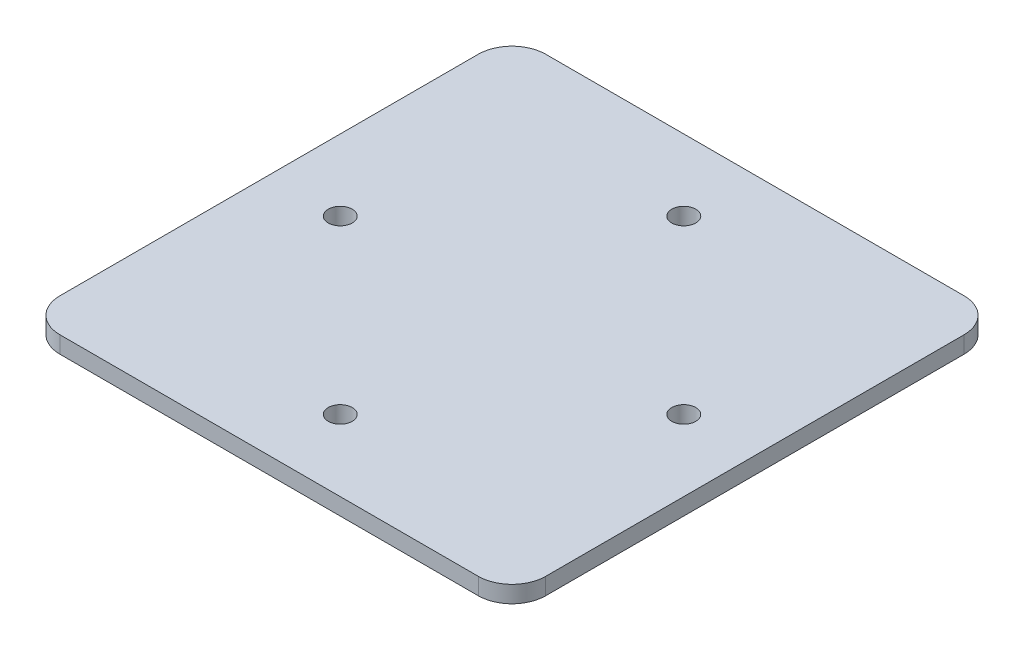
ISO-10303-21;
HEADER;
FILE_DESCRIPTION(('STEP AP214'),'2;1');
FILE_NAME('part.step','',(''),(''),'','','');
FILE_SCHEMA(('AUTOMOTIVE_DESIGN { 1 0 10303 214 1 1 1 1 }'));
ENDSEC;
DATA;
#1=APPLICATION_CONTEXT('core data for automotive mechanical design processes');
#2=APPLICATION_PROTOCOL_DEFINITION('international standard','automotive_design',2000,#1);
#3=PRODUCT_CONTEXT('',#1,'mechanical');
#4=PRODUCT('Part','Part','',(#3));
#5=PRODUCT_RELATED_PRODUCT_CATEGORY('part','',(#4));
#6=PRODUCT_DEFINITION_FORMATION('','',#4);
#7=PRODUCT_DEFINITION_CONTEXT('part definition',#1,'design');
#8=PRODUCT_DEFINITION('design','',#6,#7);
#9=PRODUCT_DEFINITION_SHAPE('','',#8);
#10=(LENGTH_UNIT() NAMED_UNIT(*) SI_UNIT(.MILLI.,.METRE.));
#11=(NAMED_UNIT(*) PLANE_ANGLE_UNIT() SI_UNIT($,.RADIAN.));
#12=(NAMED_UNIT(*) SI_UNIT($,.STERADIAN.) SOLID_ANGLE_UNIT());
#13=UNCERTAINTY_MEASURE_WITH_UNIT(LENGTH_MEASURE(1.E-05),#10,'distance_accuracy_value','');
#14=(GEOMETRIC_REPRESENTATION_CONTEXT(3) GLOBAL_UNCERTAINTY_ASSIGNED_CONTEXT((#13)) GLOBAL_UNIT_ASSIGNED_CONTEXT((#10,
#11,#12)) REPRESENTATION_CONTEXT('',''));
#15=CARTESIAN_POINT('',(0.,0.,0.));
#16=DIRECTION('',(0.,0.,1.));
#17=DIRECTION('',(1.,0.,0.));
#18=AXIS2_PLACEMENT_3D('',#15,#16,#17);
#19=CARTESIAN_POINT('',(0.,1.5875,0.));
#20=DIRECTION('',(1.,0.,0.));
#21=DIRECTION('',(0.,0.,-1.));
#22=AXIS2_PLACEMENT_3D('',#19,#20,#21);
#23=PLANE('',#22);
#24=DIRECTION('',(0.,0.,1.));
#25=VECTOR('',#24,1.);
#26=CARTESIAN_POINT('',(0.,1.5875,0.));
#27=LINE('',#26,#25);
#28=CARTESIAN_POINT('',(0.,1.5875,-42.545));
#29=VERTEX_POINT('',#28);
#30=CARTESIAN_POINT('',(0.,1.5875,-3.175));
#31=VERTEX_POINT('',#30);
#32=EDGE_CURVE('E118',#29,#31,#27,.T.);
#33=ORIENTED_EDGE('',*,*,#32,.F.);
#34=DIRECTION('',(0.,-1.,0.));
#35=VECTOR('',#34,1.);
#36=CARTESIAN_POINT('',(0.,1.5875,-42.545));
#37=LINE('',#36,#35);
#38=CARTESIAN_POINT('',(0.,0.,-42.545));
#39=VERTEX_POINT('',#38);
#40=EDGE_CURVE('E103',#29,#39,#37,.T.);
#41=ORIENTED_EDGE('',*,*,#40,.T.);
#42=DIRECTION('',(0.,0.,1.));
#43=VECTOR('',#42,1.);
#44=CARTESIAN_POINT('',(0.,0.,0.));
#45=LINE('',#44,#43);
#46=CARTESIAN_POINT('',(0.,0.,-3.175));
#47=VERTEX_POINT('',#46);
#48=EDGE_CURVE('E115',#39,#47,#45,.T.);
#49=ORIENTED_EDGE('',*,*,#48,.T.);
#50=DIRECTION('',(0.,-1.,0.));
#51=VECTOR('',#50,1.);
#52=CARTESIAN_POINT('',(0.,1.5875,-3.175));
#53=LINE('',#52,#51);
#54=EDGE_CURVE('E120',#47,#31,#53,.F.);
#55=ORIENTED_EDGE('',*,*,#54,.T.);
#56=EDGE_LOOP('',(#33,#41,#49,#55));
#57=FACE_BOUND('',#56,.T.);
#58=ADVANCED_FACE('F33',(#57),#23,.F.);
#59=CARTESIAN_POINT('',(0.,1.5875,0.));
#60=DIRECTION('',(0.,0.,-1.));
#61=DIRECTION('',(-1.,0.,0.));
#62=AXIS2_PLACEMENT_3D('',#59,#60,#61);
#63=PLANE('',#62);
#64=DIRECTION('',(1.,0.,0.));
#65=VECTOR('',#64,1.);
#66=CARTESIAN_POINT('',(0.,0.,0.));
#67=LINE('',#66,#65);
#68=CARTESIAN_POINT('',(3.175,0.,0.));
#69=VERTEX_POINT('',#68);
#70=CARTESIAN_POINT('',(42.545,0.,0.));
#71=VERTEX_POINT('',#70);
#72=EDGE_CURVE('E124',#69,#71,#67,.T.);
#73=ORIENTED_EDGE('',*,*,#72,.T.);
#74=DIRECTION('',(0.,-1.,0.));
#75=VECTOR('',#74,1.);
#76=CARTESIAN_POINT('',(42.545,1.5875,0.));
#77=LINE('',#76,#75);
#78=CARTESIAN_POINT('',(42.545,1.5875,0.));
#79=VERTEX_POINT('',#78);
#80=EDGE_CURVE('E11',#71,#79,#77,.F.);
#81=ORIENTED_EDGE('',*,*,#80,.T.);
#82=DIRECTION('',(1.,0.,0.));
#83=VECTOR('',#82,1.);
#84=CARTESIAN_POINT('',(0.,1.5875,0.));
#85=LINE('',#84,#83);
#86=CARTESIAN_POINT('',(3.175,1.5875,0.));
#87=VERTEX_POINT('',#86);
#88=EDGE_CURVE('E164',#87,#79,#85,.T.);
#89=ORIENTED_EDGE('',*,*,#88,.F.);
#90=DIRECTION('',(0.,-1.,0.));
#91=VECTOR('',#90,1.);
#92=CARTESIAN_POINT('',(3.175,1.5875,0.));
#93=LINE('',#92,#91);
#94=EDGE_CURVE('E41',#87,#69,#93,.T.);
#95=ORIENTED_EDGE('',*,*,#94,.T.);
#96=EDGE_LOOP('',(#73,#81,#89,#95));
#97=FACE_BOUND('',#96,.T.);
#98=ADVANCED_FACE('F162',(#97),#63,.F.);
#99=CARTESIAN_POINT('',(45.72,1.5875,0.));
#100=DIRECTION('',(-1.,0.,0.));
#101=DIRECTION('',(0.,0.,1.));
#102=AXIS2_PLACEMENT_3D('',#99,#100,#101);
#103=PLANE('',#102);
#104=DIRECTION('',(0.,0.,-1.));
#105=VECTOR('',#104,1.);
#106=CARTESIAN_POINT('',(45.72,0.,0.));
#107=LINE('',#106,#105);
#108=CARTESIAN_POINT('',(45.72,0.,-3.175));
#109=VERTEX_POINT('',#108);
#110=CARTESIAN_POINT('',(45.72,0.,-42.545));
#111=VERTEX_POINT('',#110);
#112=EDGE_CURVE('E128',#109,#111,#107,.T.);
#113=ORIENTED_EDGE('',*,*,#112,.T.);
#114=DIRECTION('',(0.,-1.,0.));
#115=VECTOR('',#114,1.);
#116=CARTESIAN_POINT('',(45.72,1.5875,-42.545));
#117=LINE('',#116,#115);
#118=CARTESIAN_POINT('',(45.72,1.5875,-42.545));
#119=VERTEX_POINT('',#118);
#120=EDGE_CURVE('E48',#111,#119,#117,.F.);
#121=ORIENTED_EDGE('',*,*,#120,.T.);
#122=DIRECTION('',(0.,0.,-1.));
#123=VECTOR('',#122,1.);
#124=CARTESIAN_POINT('',(45.72,1.5875,0.));
#125=LINE('',#124,#123);
#126=CARTESIAN_POINT('',(45.72,1.5875,-3.175));
#127=VERTEX_POINT('',#126);
#128=EDGE_CURVE('E172',#127,#119,#125,.T.);
#129=ORIENTED_EDGE('',*,*,#128,.F.);
#130=DIRECTION('',(0.,-1.,0.));
#131=VECTOR('',#130,1.);
#132=CARTESIAN_POINT('',(45.72,1.5875,-3.175));
#133=LINE('',#132,#131);
#134=EDGE_CURVE('E155',#127,#109,#133,.T.);
#135=ORIENTED_EDGE('',*,*,#134,.T.);
#136=EDGE_LOOP('',(#113,#121,#129,#135));
#137=FACE_BOUND('',#136,.T.);
#138=ADVANCED_FACE('F171',(#137),#103,.F.);
#139=CARTESIAN_POINT('',(0.,1.5875,-45.72));
#140=DIRECTION('',(0.,0.,1.));
#141=DIRECTION('',(1.,0.,0.));
#142=AXIS2_PLACEMENT_3D('',#139,#140,#141);
#143=PLANE('',#142);
#144=DIRECTION('',(-1.,0.,0.));
#145=VECTOR('',#144,1.);
#146=CARTESIAN_POINT('',(0.,0.,-45.72));
#147=LINE('',#146,#145);
#148=CARTESIAN_POINT('',(42.545,0.,-45.72));
#149=VERTEX_POINT('',#148);
#150=CARTESIAN_POINT('',(3.175,0.,-45.72));
#151=VERTEX_POINT('',#150);
#152=EDGE_CURVE('E138',#149,#151,#147,.T.);
#153=ORIENTED_EDGE('',*,*,#152,.T.);
#154=DIRECTION('',(0.,-1.,0.));
#155=VECTOR('',#154,1.);
#156=CARTESIAN_POINT('',(3.175,1.5875,-45.72));
#157=LINE('',#156,#155);
#158=CARTESIAN_POINT('',(3.175,1.5875,-45.72));
#159=VERTEX_POINT('',#158);
#160=EDGE_CURVE('E104',#151,#159,#157,.F.);
#161=ORIENTED_EDGE('',*,*,#160,.T.);
#162=DIRECTION('',(-1.,0.,0.));
#163=VECTOR('',#162,1.);
#164=CARTESIAN_POINT('',(0.,1.5875,-45.72));
#165=LINE('',#164,#163);
#166=CARTESIAN_POINT('',(42.545,1.5875,-45.72));
#167=VERTEX_POINT('',#166);
#168=EDGE_CURVE('E134',#167,#159,#165,.T.);
#169=ORIENTED_EDGE('',*,*,#168,.F.);
#170=DIRECTION('',(0.,-1.,0.));
#171=VECTOR('',#170,1.);
#172=CARTESIAN_POINT('',(42.545,1.5875,-45.72));
#173=LINE('',#172,#171);
#174=EDGE_CURVE('E109',#167,#149,#173,.T.);
#175=ORIENTED_EDGE('',*,*,#174,.T.);
#176=EDGE_LOOP('',(#153,#161,#169,#175));
#177=FACE_BOUND('',#176,.T.);
#178=ADVANCED_FACE('F204',(#177),#143,.F.);
#179=CARTESIAN_POINT('',(0.,1.5875,0.));
#180=DIRECTION('',(0.,-1.,0.));
#181=DIRECTION('',(0.,0.,-1.));
#182=AXIS2_PLACEMENT_3D('',#179,#180,#181);
#183=PLANE('',#182);
#184=CARTESIAN_POINT('',(39.0244610179245,1.5875,-22.86));
#185=DIRECTION('',(0.,1.,0.));
#186=DIRECTION('',(0.,0.,1.));
#187=AXIS2_PLACEMENT_3D('',#184,#185,#186);
#188=CIRCLE('',#187,1.1303);
#189=CARTESIAN_POINT('',(39.0244610179245,1.5875,-21.7297));
#190=VERTEX_POINT('',#189);
#191=EDGE_CURVE('E131',#190,#190,#188,.T.);
#192=ORIENTED_EDGE('',*,*,#191,.F.);
#193=EDGE_LOOP('',(#192));
#194=FACE_BOUND('',#193,.T.);
#195=CARTESIAN_POINT('',(22.86,1.5875,-6.69553898207553));
#196=DIRECTION('',(0.,1.,0.));
#197=DIRECTION('',(0.,0.,1.));
#198=AXIS2_PLACEMENT_3D('',#195,#196,#197);
#199=CIRCLE('',#198,1.1303);
#200=CARTESIAN_POINT('',(22.86,1.5875,-5.56523898207553));
#201=VERTEX_POINT('',#200);
#202=EDGE_CURVE('E190',#201,#201,#199,.T.);
#203=ORIENTED_EDGE('',*,*,#202,.F.);
#204=EDGE_LOOP('',(#203));
#205=FACE_BOUND('',#204,.T.);
#206=CARTESIAN_POINT('',(6.69553898207553,1.5875,-22.86));
#207=DIRECTION('',(0.,1.,0.));
#208=DIRECTION('',(0.,0.,1.));
#209=AXIS2_PLACEMENT_3D('',#206,#207,#208);
#210=CIRCLE('',#209,1.1303);
#211=CARTESIAN_POINT('',(6.69553898207553,1.5875,-21.7297));
#212=VERTEX_POINT('',#211);
#213=EDGE_CURVE('E184',#212,#212,#210,.T.);
#214=ORIENTED_EDGE('',*,*,#213,.F.);
#215=EDGE_LOOP('',(#214));
#216=FACE_BOUND('',#215,.T.);
#217=CARTESIAN_POINT('',(22.86,1.5875,-39.0244610179245));
#218=DIRECTION('',(0.,1.,0.));
#219=DIRECTION('',(0.,0.,1.));
#220=AXIS2_PLACEMENT_3D('',#217,#218,#219);
#221=CIRCLE('',#220,1.1303);
#222=CARTESIAN_POINT('',(22.86,1.5875,-37.8941610179245));
#223=VERTEX_POINT('',#222);
#224=EDGE_CURVE('E178',#223,#223,#221,.T.);
#225=ORIENTED_EDGE('',*,*,#224,.F.);
#226=EDGE_LOOP('',(#225));
#227=FACE_BOUND('',#226,.T.);
#228=ORIENTED_EDGE('',*,*,#168,.T.);
#229=CARTESIAN_POINT('',(3.175,1.5875,-42.545));
#230=DIRECTION('',(0.,-1.,0.));
#231=DIRECTION('',(0.,0.,-1.));
#232=AXIS2_PLACEMENT_3D('',#229,#230,#231);
#233=CIRCLE('',#232,3.175);
#234=EDGE_CURVE('E153',#159,#29,#233,.F.);
#235=ORIENTED_EDGE('',*,*,#234,.T.);
#236=ORIENTED_EDGE('',*,*,#32,.T.);
#237=CARTESIAN_POINT('',(3.175,1.5875,-3.175));
#238=DIRECTION('',(0.,-1.,0.));
#239=DIRECTION('',(0.,0.,-1.));
#240=AXIS2_PLACEMENT_3D('',#237,#238,#239);
#241=CIRCLE('',#240,3.175);
#242=EDGE_CURVE('E148',#31,#87,#241,.F.);
#243=ORIENTED_EDGE('',*,*,#242,.T.);
#244=ORIENTED_EDGE('',*,*,#88,.T.);
#245=CARTESIAN_POINT('',(42.545,1.5875,-3.175));
#246=DIRECTION('',(0.,-1.,0.));
#247=DIRECTION('',(0.,0.,-1.));
#248=AXIS2_PLACEMENT_3D('',#245,#246,#247);
#249=CIRCLE('',#248,3.175);
#250=EDGE_CURVE('E55',#79,#127,#249,.F.);
#251=ORIENTED_EDGE('',*,*,#250,.T.);
#252=ORIENTED_EDGE('',*,*,#128,.T.);
#253=CARTESIAN_POINT('',(42.545,1.5875,-42.545));
#254=DIRECTION('',(0.,-1.,0.));
#255=DIRECTION('',(0.,0.,-1.));
#256=AXIS2_PLACEMENT_3D('',#253,#254,#255);
#257=CIRCLE('',#256,3.175);
#258=EDGE_CURVE('E151',#119,#167,#257,.F.);
#259=ORIENTED_EDGE('',*,*,#258,.T.);
#260=EDGE_LOOP('',(#228,#235,#236,#243,#244,#251,#252,#259));
#261=FACE_BOUND('',#260,.T.);
#262=ADVANCED_FACE('F201',(#194,#205,#216,#227,#261),#183,.F.);
#263=CARTESIAN_POINT('',(0.,0.,0.));
#264=DIRECTION('',(0.,-1.,0.));
#265=DIRECTION('',(0.,0.,-1.));
#266=AXIS2_PLACEMENT_3D('',#263,#264,#265);
#267=PLANE('',#266);
#268=CARTESIAN_POINT('',(39.0244610179245,0.,-22.86));
#269=DIRECTION('',(0.,1.,0.));
#270=DIRECTION('',(0.,0.,1.));
#271=AXIS2_PLACEMENT_3D('',#268,#269,#270);
#272=CIRCLE('',#271,1.1303);
#273=CARTESIAN_POINT('',(39.0244610179245,0.,-21.7297));
#274=VERTEX_POINT('',#273);
#275=EDGE_CURVE('E125',#274,#274,#272,.T.);
#276=ORIENTED_EDGE('',*,*,#275,.T.);
#277=EDGE_LOOP('',(#276));
#278=FACE_BOUND('',#277,.T.);
#279=CARTESIAN_POINT('',(22.86,0.,-6.69553898207553));
#280=DIRECTION('',(0.,1.,0.));
#281=DIRECTION('',(0.,0.,1.));
#282=AXIS2_PLACEMENT_3D('',#279,#280,#281);
#283=CIRCLE('',#282,1.1303);
#284=CARTESIAN_POINT('',(22.86,0.,-5.56523898207553));
#285=VERTEX_POINT('',#284);
#286=EDGE_CURVE('E193',#285,#285,#283,.T.);
#287=ORIENTED_EDGE('',*,*,#286,.T.);
#288=EDGE_LOOP('',(#287));
#289=FACE_BOUND('',#288,.T.);
#290=CARTESIAN_POINT('',(6.69553898207553,0.,-22.86));
#291=DIRECTION('',(0.,1.,0.));
#292=DIRECTION('',(0.,0.,1.));
#293=AXIS2_PLACEMENT_3D('',#290,#291,#292);
#294=CIRCLE('',#293,1.1303);
#295=CARTESIAN_POINT('',(6.69553898207553,0.,-21.7297));
#296=VERTEX_POINT('',#295);
#297=EDGE_CURVE('E187',#296,#296,#294,.T.);
#298=ORIENTED_EDGE('',*,*,#297,.T.);
#299=EDGE_LOOP('',(#298));
#300=FACE_BOUND('',#299,.T.);
#301=CARTESIAN_POINT('',(22.86,0.,-39.0244610179245));
#302=DIRECTION('',(0.,1.,0.));
#303=DIRECTION('',(0.,0.,1.));
#304=AXIS2_PLACEMENT_3D('',#301,#302,#303);
#305=CIRCLE('',#304,1.1303);
#306=CARTESIAN_POINT('',(22.86,0.,-37.8941610179245));
#307=VERTEX_POINT('',#306);
#308=EDGE_CURVE('E181',#307,#307,#305,.T.);
#309=ORIENTED_EDGE('',*,*,#308,.T.);
#310=EDGE_LOOP('',(#309));
#311=FACE_BOUND('',#310,.T.);
#312=ORIENTED_EDGE('',*,*,#48,.F.);
#313=CARTESIAN_POINT('',(3.175,0.,-42.545));
#314=DIRECTION('',(0.,-1.,0.));
#315=DIRECTION('',(0.,0.,-1.));
#316=AXIS2_PLACEMENT_3D('',#313,#314,#315);
#317=CIRCLE('',#316,3.175);
#318=EDGE_CURVE('E99',#39,#151,#317,.T.);
#319=ORIENTED_EDGE('',*,*,#318,.T.);
#320=ORIENTED_EDGE('',*,*,#152,.F.);
#321=CARTESIAN_POINT('',(42.545,0.,-42.545));
#322=DIRECTION('',(0.,-1.,0.));
#323=DIRECTION('',(0.,0.,-1.));
#324=AXIS2_PLACEMENT_3D('',#321,#322,#323);
#325=CIRCLE('',#324,3.175);
#326=EDGE_CURVE('E110',#149,#111,#325,.T.);
#327=ORIENTED_EDGE('',*,*,#326,.T.);
#328=ORIENTED_EDGE('',*,*,#112,.F.);
#329=CARTESIAN_POINT('',(42.545,0.,-3.175));
#330=DIRECTION('',(0.,-1.,0.));
#331=DIRECTION('',(0.,0.,-1.));
#332=AXIS2_PLACEMENT_3D('',#329,#330,#331);
#333=CIRCLE('',#332,3.175);
#334=EDGE_CURVE('E142',#109,#71,#333,.T.);
#335=ORIENTED_EDGE('',*,*,#334,.T.);
#336=ORIENTED_EDGE('',*,*,#72,.F.);
#337=CARTESIAN_POINT('',(3.175,0.,-3.175));
#338=DIRECTION('',(0.,-1.,0.));
#339=DIRECTION('',(0.,0.,-1.));
#340=AXIS2_PLACEMENT_3D('',#337,#338,#339);
#341=CIRCLE('',#340,3.175);
#342=EDGE_CURVE('E119',#69,#47,#341,.T.);
#343=ORIENTED_EDGE('',*,*,#342,.T.);
#344=EDGE_LOOP('',(#312,#319,#320,#327,#328,#335,#336,#343));
#345=FACE_BOUND('',#344,.T.);
#346=ADVANCED_FACE('F122',(#278,#289,#300,#311,#345),#267,.T.);
#347=CARTESIAN_POINT('',(3.175,1.5875,-42.545));
#348=DIRECTION('',(0.,-1.,0.));
#349=DIRECTION('',(0.,0.,-1.));
#350=AXIS2_PLACEMENT_3D('',#347,#348,#349);
#351=CYLINDRICAL_SURFACE('',#350,3.175);
#352=ORIENTED_EDGE('',*,*,#234,.F.);
#353=ORIENTED_EDGE('',*,*,#160,.F.);
#354=ORIENTED_EDGE('',*,*,#318,.F.);
#355=ORIENTED_EDGE('',*,*,#40,.F.);
#356=EDGE_LOOP('',(#352,#353,#354,#355));
#357=FACE_BOUND('',#356,.T.);
#358=ADVANCED_FACE('F102',(#357),#351,.T.);
#359=CARTESIAN_POINT('',(42.545,1.5875,-42.545));
#360=DIRECTION('',(0.,-1.,0.));
#361=DIRECTION('',(0.,0.,-1.));
#362=AXIS2_PLACEMENT_3D('',#359,#360,#361);
#363=CYLINDRICAL_SURFACE('',#362,3.175);
#364=ORIENTED_EDGE('',*,*,#258,.F.);
#365=ORIENTED_EDGE('',*,*,#120,.F.);
#366=ORIENTED_EDGE('',*,*,#326,.F.);
#367=ORIENTED_EDGE('',*,*,#174,.F.);
#368=EDGE_LOOP('',(#364,#365,#366,#367));
#369=FACE_BOUND('',#368,.T.);
#370=ADVANCED_FACE('F215',(#369),#363,.T.);
#371=CARTESIAN_POINT('',(42.545,1.5875,-3.175));
#372=DIRECTION('',(0.,-1.,0.));
#373=DIRECTION('',(0.,0.,-1.));
#374=AXIS2_PLACEMENT_3D('',#371,#372,#373);
#375=CYLINDRICAL_SURFACE('',#374,3.175);
#376=ORIENTED_EDGE('',*,*,#250,.F.);
#377=ORIENTED_EDGE('',*,*,#80,.F.);
#378=ORIENTED_EDGE('',*,*,#334,.F.);
#379=ORIENTED_EDGE('',*,*,#134,.F.);
#380=EDGE_LOOP('',(#376,#377,#378,#379));
#381=FACE_BOUND('',#380,.T.);
#382=ADVANCED_FACE('F170',(#381),#375,.T.);
#383=CARTESIAN_POINT('',(3.175,1.5875,-3.175));
#384=DIRECTION('',(0.,-1.,0.));
#385=DIRECTION('',(0.,0.,-1.));
#386=AXIS2_PLACEMENT_3D('',#383,#384,#385);
#387=CYLINDRICAL_SURFACE('',#386,3.175);
#388=ORIENTED_EDGE('',*,*,#242,.F.);
#389=ORIENTED_EDGE('',*,*,#54,.F.);
#390=ORIENTED_EDGE('',*,*,#342,.F.);
#391=ORIENTED_EDGE('',*,*,#94,.F.);
#392=EDGE_LOOP('',(#388,#389,#390,#391));
#393=FACE_BOUND('',#392,.T.);
#394=ADVANCED_FACE('F35',(#393),#387,.T.);
#395=CARTESIAN_POINT('',(22.86,0.,-39.0244610179245));
#396=DIRECTION('',(0.,1.,0.));
#397=DIRECTION('',(0.,0.,1.));
#398=AXIS2_PLACEMENT_3D('',#395,#396,#397);
#399=CYLINDRICAL_SURFACE('',#398,1.1303);
#400=ORIENTED_EDGE('',*,*,#308,.F.);
#401=EDGE_LOOP('',(#400));
#402=FACE_BOUND('',#401,.T.);
#403=ORIENTED_EDGE('',*,*,#224,.T.);
#404=EDGE_LOOP('',(#403));
#405=FACE_BOUND('',#404,.T.);
#406=ADVANCED_FACE('F237',(#402,#405),#399,.F.);
#407=CARTESIAN_POINT('',(6.69553898207553,0.,-22.86));
#408=DIRECTION('',(0.,1.,0.));
#409=DIRECTION('',(0.,0.,1.));
#410=AXIS2_PLACEMENT_3D('',#407,#408,#409);
#411=CYLINDRICAL_SURFACE('',#410,1.1303);
#412=ORIENTED_EDGE('',*,*,#297,.F.);
#413=EDGE_LOOP('',(#412));
#414=FACE_BOUND('',#413,.T.);
#415=ORIENTED_EDGE('',*,*,#213,.T.);
#416=EDGE_LOOP('',(#415));
#417=FACE_BOUND('',#416,.T.);
#418=ADVANCED_FACE('F240',(#414,#417),#411,.F.);
#419=CARTESIAN_POINT('',(22.86,0.,-6.69553898207553));
#420=DIRECTION('',(0.,1.,0.));
#421=DIRECTION('',(0.,0.,1.));
#422=AXIS2_PLACEMENT_3D('',#419,#420,#421);
#423=CYLINDRICAL_SURFACE('',#422,1.1303);
#424=ORIENTED_EDGE('',*,*,#286,.F.);
#425=EDGE_LOOP('',(#424));
#426=FACE_BOUND('',#425,.T.);
#427=ORIENTED_EDGE('',*,*,#202,.T.);
#428=EDGE_LOOP('',(#427));
#429=FACE_BOUND('',#428,.T.);
#430=ADVANCED_FACE('F244',(#426,#429),#423,.F.);
#431=CARTESIAN_POINT('',(39.0244610179245,0.,-22.86));
#432=DIRECTION('',(0.,1.,0.));
#433=DIRECTION('',(0.,0.,1.));
#434=AXIS2_PLACEMENT_3D('',#431,#432,#433);
#435=CYLINDRICAL_SURFACE('',#434,1.1303);
#436=ORIENTED_EDGE('',*,*,#275,.F.);
#437=EDGE_LOOP('',(#436));
#438=FACE_BOUND('',#437,.T.);
#439=ORIENTED_EDGE('',*,*,#191,.T.);
#440=EDGE_LOOP('',(#439));
#441=FACE_BOUND('',#440,.T.);
#442=ADVANCED_FACE('F199',(#438,#441),#435,.F.);
#443=CLOSED_SHELL('',(#58,#98,#138,#178,#262,#346,#358,#370,#382,#394,#406,#418,#430,#442));
#444=MANIFOLD_SOLID_BREP('B2',#443);
#445=ADVANCED_BREP_SHAPE_REPRESENTATION('',(#18,#444),#14);
#446=SHAPE_DEFINITION_REPRESENTATION(#9,#445);
ENDSEC;
END-ISO-10303-21;
